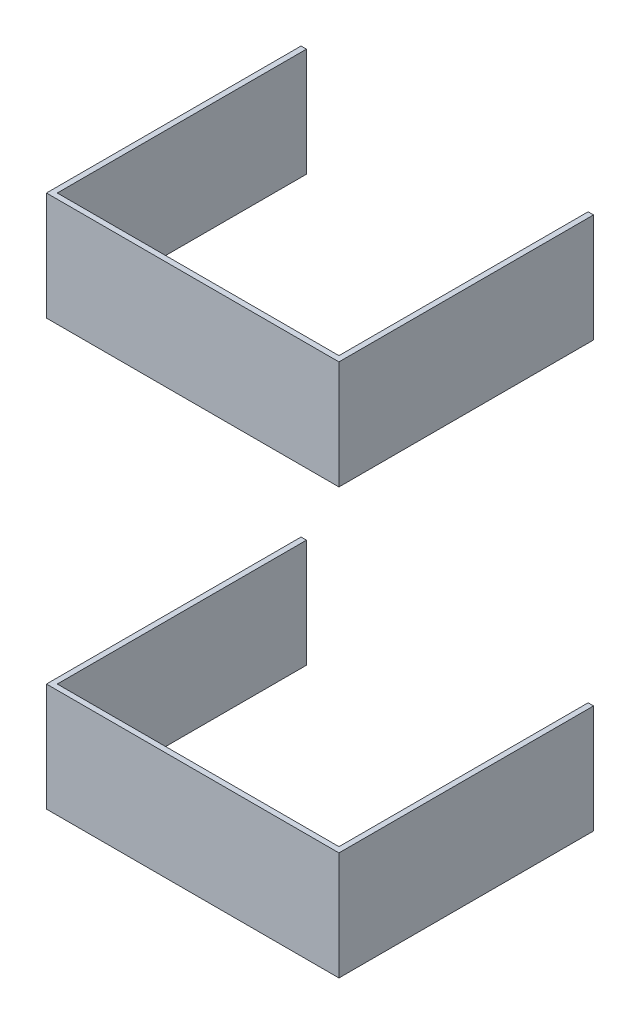
ISO-10303-21;
HEADER;
FILE_DESCRIPTION(('STEP AP214'),'2;1');
FILE_NAME('part.step','',(''),(''),'','','');
FILE_SCHEMA(('AUTOMOTIVE_DESIGN { 1 0 10303 214 1 1 1 1 }'));
ENDSEC;
DATA;
#1=APPLICATION_CONTEXT('core data for automotive mechanical design processes');
#2=APPLICATION_PROTOCOL_DEFINITION('international standard','automotive_design',2000,#1);
#3=PRODUCT_CONTEXT('',#1,'mechanical');
#4=PRODUCT('Part','Part','',(#3));
#5=PRODUCT_RELATED_PRODUCT_CATEGORY('part','',(#4));
#6=PRODUCT_DEFINITION_FORMATION('','',#4);
#7=PRODUCT_DEFINITION_CONTEXT('part definition',#1,'design');
#8=PRODUCT_DEFINITION('design','',#6,#7);
#9=PRODUCT_DEFINITION_SHAPE('','',#8);
#10=(LENGTH_UNIT() NAMED_UNIT(*) SI_UNIT(.MILLI.,.METRE.));
#11=(NAMED_UNIT(*) PLANE_ANGLE_UNIT() SI_UNIT($,.RADIAN.));
#12=(NAMED_UNIT(*) SI_UNIT($,.STERADIAN.) SOLID_ANGLE_UNIT());
#13=UNCERTAINTY_MEASURE_WITH_UNIT(LENGTH_MEASURE(1.E-05),#10,'distance_accuracy_value','');
#14=(GEOMETRIC_REPRESENTATION_CONTEXT(3) GLOBAL_UNCERTAINTY_ASSIGNED_CONTEXT((#13)) GLOBAL_UNIT_ASSIGNED_CONTEXT((#10,
#11,#12)) REPRESENTATION_CONTEXT('',''));
#15=CARTESIAN_POINT('',(0.,0.,0.));
#16=DIRECTION('',(0.,0.,1.));
#17=DIRECTION('',(1.,0.,0.));
#18=AXIS2_PLACEMENT_3D('',#15,#16,#17);
#19=CARTESIAN_POINT('',(1.,-28.25,183.5));
#20=DIRECTION('',(0.,1.,0.));
#21=DIRECTION('',(1.,0.,0.));
#22=AXIS2_PLACEMENT_3D('',#19,#20,#21);
#23=PLANE('',#22);
#24=DIRECTION('',(-1.,0.,0.));
#25=VECTOR('',#24,1.);
#26=CARTESIAN_POINT('',(1.,-28.25,230.5));
#27=LINE('',#26,#25);
#28=CARTESIAN_POINT('',(1.,-28.25,230.5));
#29=VERTEX_POINT('',#28);
#30=CARTESIAN_POINT('',(-53.,-28.25,230.5));
#31=VERTEX_POINT('',#30);
#32=EDGE_CURVE('P0_E177',#29,#31,#27,.T.);
#33=ORIENTED_EDGE('',*,*,#32,.F.);
#34=DIRECTION('',(0.,0.,1.));
#35=VECTOR('',#34,1.);
#36=CARTESIAN_POINT('',(1.,-28.25,183.5));
#37=LINE('',#36,#35);
#38=CARTESIAN_POINT('',(1.,-28.25,183.5));
#39=VERTEX_POINT('',#38);
#40=EDGE_CURVE('P0_E10',#39,#29,#37,.T.);
#41=ORIENTED_EDGE('',*,*,#40,.F.);
#42=DIRECTION('',(-1.,0.,0.));
#43=VECTOR('',#42,1.);
#44=CARTESIAN_POINT('',(1.,-28.25,183.5));
#45=LINE('',#44,#43);
#46=CARTESIAN_POINT('',(0.,-28.25,183.5));
#47=VERTEX_POINT('',#46);
#48=EDGE_CURVE('P0_E162',#39,#47,#45,.T.);
#49=ORIENTED_EDGE('',*,*,#48,.T.);
#50=DIRECTION('',(0.,0.,1.));
#51=VECTOR('',#50,1.);
#52=CARTESIAN_POINT('',(0.,-28.25,182.5));
#53=LINE('',#52,#51);
#54=CARTESIAN_POINT('',(0.,-28.25,229.5));
#55=VERTEX_POINT('',#54);
#56=EDGE_CURVE('P0_E146',#47,#55,#53,.T.);
#57=ORIENTED_EDGE('',*,*,#56,.T.);
#58=DIRECTION('',(1.,0.,0.));
#59=VECTOR('',#58,1.);
#60=CARTESIAN_POINT('',(0.5,-28.25,229.5));
#61=LINE('',#60,#59);
#62=CARTESIAN_POINT('',(-52.,-28.25,229.5));
#63=VERTEX_POINT('',#62);
#64=EDGE_CURVE('P0_E147',#63,#55,#61,.T.);
#65=ORIENTED_EDGE('',*,*,#64,.F.);
#66=DIRECTION('',(0.,0.,1.));
#67=VECTOR('',#66,1.);
#68=CARTESIAN_POINT('',(-52.,-28.25,182.5));
#69=LINE('',#68,#67);
#70=CARTESIAN_POINT('',(-52.,-28.25,183.5));
#71=VERTEX_POINT('',#70);
#72=EDGE_CURVE('P0_E110',#71,#63,#69,.T.);
#73=ORIENTED_EDGE('',*,*,#72,.F.);
#74=DIRECTION('',(-1.,0.,0.));
#75=VECTOR('',#74,1.);
#76=CARTESIAN_POINT('',(1.,-28.25,183.5));
#77=LINE('',#76,#75);
#78=CARTESIAN_POINT('',(-53.,-28.25,183.5));
#79=VERTEX_POINT('',#78);
#80=EDGE_CURVE('P0_E108',#71,#79,#77,.T.);
#81=ORIENTED_EDGE('',*,*,#80,.T.);
#82=DIRECTION('',(0.,0.,1.));
#83=VECTOR('',#82,1.);
#84=CARTESIAN_POINT('',(-53.,-28.25,183.5));
#85=LINE('',#84,#83);
#86=EDGE_CURVE('P0_E158',#79,#31,#85,.T.);
#87=ORIENTED_EDGE('',*,*,#86,.T.);
#88=EDGE_LOOP('',(#33,#41,#49,#57,#65,#73,#81,#87));
#89=FACE_BOUND('',#88,.T.);
#90=ADVANCED_FACE('P0_F15',(#89),#23,.T.);
#91=CARTESIAN_POINT('',(1.,-48.25,183.5));
#92=DIRECTION('',(-1.,0.,0.));
#93=DIRECTION('',(0.,0.,1.));
#94=AXIS2_PLACEMENT_3D('',#91,#92,#93);
#95=PLANE('',#94);
#96=ORIENTED_EDGE('',*,*,#40,.T.);
#97=DIRECTION('',(0.,1.,0.));
#98=VECTOR('',#97,1.);
#99=CARTESIAN_POINT('',(1.,-48.25,230.5));
#100=LINE('',#99,#98);
#101=CARTESIAN_POINT('',(1.,-48.25,230.5));
#102=VERTEX_POINT('',#101);
#103=EDGE_CURVE('P0_E173',#102,#29,#100,.T.);
#104=ORIENTED_EDGE('',*,*,#103,.F.);
#105=DIRECTION('',(0.,0.,1.));
#106=VECTOR('',#105,1.);
#107=CARTESIAN_POINT('',(1.,-48.25,183.5));
#108=LINE('',#107,#106);
#109=CARTESIAN_POINT('',(1.,-48.25,183.5));
#110=VERTEX_POINT('',#109);
#111=EDGE_CURVE('P0_E134',#110,#102,#108,.T.);
#112=ORIENTED_EDGE('',*,*,#111,.F.);
#113=DIRECTION('',(0.,1.,0.));
#114=VECTOR('',#113,1.);
#115=CARTESIAN_POINT('',(1.,-48.25,183.5));
#116=LINE('',#115,#114);
#117=EDGE_CURVE('P0_E26',#110,#39,#116,.T.);
#118=ORIENTED_EDGE('',*,*,#117,.T.);
#119=EDGE_LOOP('',(#96,#104,#112,#118));
#120=FACE_BOUND('',#119,.T.);
#121=ADVANCED_FACE('P0_F205',(#120),#95,.F.);
#122=CARTESIAN_POINT('',(1.,-48.25,183.5));
#123=DIRECTION('',(0.,0.,1.));
#124=DIRECTION('',(1.,0.,0.));
#125=AXIS2_PLACEMENT_3D('',#122,#123,#124);
#126=PLANE('',#125);
#127=DIRECTION('',(0.,-1.,0.));
#128=VECTOR('',#127,1.);
#129=CARTESIAN_POINT('',(0.,-48.75,183.5));
#130=LINE('',#129,#128);
#131=CARTESIAN_POINT('',(0.,-48.25,183.5));
#132=VERTEX_POINT('',#131);
#133=EDGE_CURVE('P0_E150',#47,#132,#130,.T.);
#134=ORIENTED_EDGE('',*,*,#133,.F.);
#135=ORIENTED_EDGE('',*,*,#48,.F.);
#136=ORIENTED_EDGE('',*,*,#117,.F.);
#137=DIRECTION('',(-1.,0.,0.));
#138=VECTOR('',#137,1.);
#139=CARTESIAN_POINT('',(1.,-48.25,183.5));
#140=LINE('',#139,#138);
#141=EDGE_CURVE('P0_E138',#110,#132,#140,.T.);
#142=ORIENTED_EDGE('',*,*,#141,.T.);
#143=EDGE_LOOP('',(#134,#135,#136,#142));
#144=FACE_BOUND('',#143,.T.);
#145=ADVANCED_FACE('P0_F202',(#144),#126,.F.);
#146=CARTESIAN_POINT('',(0.,-49.25,181.5));
#147=DIRECTION('',(-1.,0.,0.));
#148=DIRECTION('',(0.,0.,1.));
#149=AXIS2_PLACEMENT_3D('',#146,#147,#148);
#150=PLANE('',#149);
#151=DIRECTION('',(0.,1.,0.));
#152=VECTOR('',#151,1.);
#153=CARTESIAN_POINT('',(0.,-49.25,229.5));
#154=LINE('',#153,#152);
#155=CARTESIAN_POINT('',(0.,-48.25,229.5));
#156=VERTEX_POINT('',#155);
#157=EDGE_CURVE('P0_E142',#156,#55,#154,.T.);
#158=ORIENTED_EDGE('',*,*,#157,.T.);
#159=ORIENTED_EDGE('',*,*,#56,.F.);
#160=ORIENTED_EDGE('',*,*,#133,.T.);
#161=DIRECTION('',(0.,0.,1.));
#162=VECTOR('',#161,1.);
#163=CARTESIAN_POINT('',(0.,-48.25,182.5));
#164=LINE('',#163,#162);
#165=EDGE_CURVE('P0_E133',#132,#156,#164,.T.);
#166=ORIENTED_EDGE('',*,*,#165,.T.);
#167=EDGE_LOOP('',(#158,#159,#160,#166));
#168=FACE_BOUND('',#167,.T.);
#169=ADVANCED_FACE('P0_F194',(#168),#150,.T.);
#170=CARTESIAN_POINT('',(0.,-49.25,229.5));
#171=DIRECTION('',(0.,0.,1.));
#172=DIRECTION('',(1.,0.,0.));
#173=AXIS2_PLACEMENT_3D('',#170,#171,#172);
#174=PLANE('',#173);
#175=ORIENTED_EDGE('',*,*,#64,.T.);
#176=ORIENTED_EDGE('',*,*,#157,.F.);
#177=DIRECTION('',(1.,0.,0.));
#178=VECTOR('',#177,1.);
#179=CARTESIAN_POINT('',(0.5,-48.25,229.5));
#180=LINE('',#179,#178);
#181=CARTESIAN_POINT('',(-52.,-48.25,229.5));
#182=VERTEX_POINT('',#181);
#183=EDGE_CURVE('P0_E118',#182,#156,#180,.T.);
#184=ORIENTED_EDGE('',*,*,#183,.F.);
#185=DIRECTION('',(0.,1.,0.));
#186=VECTOR('',#185,1.);
#187=CARTESIAN_POINT('',(-52.,-49.25,229.5));
#188=LINE('',#187,#186);
#189=EDGE_CURVE('P0_E94',#182,#63,#188,.T.);
#190=ORIENTED_EDGE('',*,*,#189,.T.);
#191=EDGE_LOOP('',(#175,#176,#184,#190));
#192=FACE_BOUND('',#191,.T.);
#193=ADVANCED_FACE('P0_F199',(#192),#174,.F.);
#194=CARTESIAN_POINT('',(-52.,-49.25,181.5));
#195=DIRECTION('',(-1.,0.,0.));
#196=DIRECTION('',(0.,0.,1.));
#197=AXIS2_PLACEMENT_3D('',#194,#195,#196);
#198=PLANE('',#197);
#199=DIRECTION('',(0.,0.,1.));
#200=VECTOR('',#199,1.);
#201=CARTESIAN_POINT('',(-52.,-48.25,182.5));
#202=LINE('',#201,#200);
#203=CARTESIAN_POINT('',(-52.,-48.25,183.5));
#204=VERTEX_POINT('',#203);
#205=EDGE_CURVE('P0_E113',#204,#182,#202,.T.);
#206=ORIENTED_EDGE('',*,*,#205,.F.);
#207=DIRECTION('',(0.,-1.,0.));
#208=VECTOR('',#207,1.);
#209=CARTESIAN_POINT('',(-52.,-48.75,183.5));
#210=LINE('',#209,#208);
#211=EDGE_CURVE('P0_E103',#71,#204,#210,.T.);
#212=ORIENTED_EDGE('',*,*,#211,.F.);
#213=ORIENTED_EDGE('',*,*,#72,.T.);
#214=ORIENTED_EDGE('',*,*,#189,.F.);
#215=EDGE_LOOP('',(#206,#212,#213,#214));
#216=FACE_BOUND('',#215,.T.);
#217=ADVANCED_FACE('P0_F114',(#216),#198,.F.);
#218=CARTESIAN_POINT('',(1.,-48.25,183.5));
#219=DIRECTION('',(0.,0.,1.));
#220=DIRECTION('',(1.,0.,0.));
#221=AXIS2_PLACEMENT_3D('',#218,#219,#220);
#222=PLANE('',#221);
#223=DIRECTION('',(0.,1.,0.));
#224=VECTOR('',#223,1.);
#225=CARTESIAN_POINT('',(-53.,-48.25,183.5));
#226=LINE('',#225,#224);
#227=CARTESIAN_POINT('',(-53.,-48.25,183.5));
#228=VERTEX_POINT('',#227);
#229=EDGE_CURVE('P0_E166',#228,#79,#226,.T.);
#230=ORIENTED_EDGE('',*,*,#229,.T.);
#231=ORIENTED_EDGE('',*,*,#80,.F.);
#232=ORIENTED_EDGE('',*,*,#211,.T.);
#233=DIRECTION('',(-1.,0.,0.));
#234=VECTOR('',#233,1.);
#235=CARTESIAN_POINT('',(1.,-48.25,183.5));
#236=LINE('',#235,#234);
#237=EDGE_CURVE('P0_E106',#204,#228,#236,.T.);
#238=ORIENTED_EDGE('',*,*,#237,.T.);
#239=EDGE_LOOP('',(#230,#231,#232,#238));
#240=FACE_BOUND('',#239,.T.);
#241=ADVANCED_FACE('P0_F17',(#240),#222,.F.);
#242=CARTESIAN_POINT('',(-53.,-48.25,183.5));
#243=DIRECTION('',(-1.,0.,0.));
#244=DIRECTION('',(0.,0.,1.));
#245=AXIS2_PLACEMENT_3D('',#242,#243,#244);
#246=PLANE('',#245);
#247=ORIENTED_EDGE('',*,*,#229,.F.);
#248=DIRECTION('',(0.,0.,1.));
#249=VECTOR('',#248,1.);
#250=CARTESIAN_POINT('',(-53.,-48.25,183.5));
#251=LINE('',#250,#249);
#252=CARTESIAN_POINT('',(-53.,-48.25,230.5));
#253=VERTEX_POINT('',#252);
#254=EDGE_CURVE('P0_E123',#228,#253,#251,.T.);
#255=ORIENTED_EDGE('',*,*,#254,.T.);
#256=DIRECTION('',(0.,1.,0.));
#257=VECTOR('',#256,1.);
#258=CARTESIAN_POINT('',(-53.,-48.25,230.5));
#259=LINE('',#258,#257);
#260=EDGE_CURVE('P0_E19',#253,#31,#259,.T.);
#261=ORIENTED_EDGE('',*,*,#260,.T.);
#262=ORIENTED_EDGE('',*,*,#86,.F.);
#263=EDGE_LOOP('',(#247,#255,#261,#262));
#264=FACE_BOUND('',#263,.T.);
#265=ADVANCED_FACE('P0_F209',(#264),#246,.T.);
#266=CARTESIAN_POINT('',(1.,-48.25,230.5));
#267=DIRECTION('',(0.,0.,1.));
#268=DIRECTION('',(1.,0.,0.));
#269=AXIS2_PLACEMENT_3D('',#266,#267,#268);
#270=PLANE('',#269);
#271=DIRECTION('',(-1.,0.,0.));
#272=VECTOR('',#271,1.);
#273=CARTESIAN_POINT('',(1.,-48.25,230.5));
#274=LINE('',#273,#272);
#275=EDGE_CURVE('P0_E137',#102,#253,#274,.T.);
#276=ORIENTED_EDGE('',*,*,#275,.F.);
#277=ORIENTED_EDGE('',*,*,#103,.T.);
#278=ORIENTED_EDGE('',*,*,#32,.T.);
#279=ORIENTED_EDGE('',*,*,#260,.F.);
#280=EDGE_LOOP('',(#276,#277,#278,#279));
#281=FACE_BOUND('',#280,.T.);
#282=ADVANCED_FACE('P0_F206',(#281),#270,.T.);
#283=CARTESIAN_POINT('',(1.,-48.25,183.5));
#284=DIRECTION('',(0.,1.,0.));
#285=DIRECTION('',(1.,0.,0.));
#286=AXIS2_PLACEMENT_3D('',#283,#284,#285);
#287=PLANE('',#286);
#288=ORIENTED_EDGE('',*,*,#254,.F.);
#289=ORIENTED_EDGE('',*,*,#237,.F.);
#290=ORIENTED_EDGE('',*,*,#205,.T.);
#291=ORIENTED_EDGE('',*,*,#183,.T.);
#292=ORIENTED_EDGE('',*,*,#165,.F.);
#293=ORIENTED_EDGE('',*,*,#141,.F.);
#294=ORIENTED_EDGE('',*,*,#111,.T.);
#295=ORIENTED_EDGE('',*,*,#275,.T.);
#296=EDGE_LOOP('',(#288,#289,#290,#291,#292,#293,#294,#295));
#297=FACE_BOUND('',#296,.T.);
#298=ADVANCED_FACE('P0_F120',(#297),#287,.F.);
#299=CLOSED_SHELL('',(#90,#121,#145,#169,#193,#217,#241,#265,#282,#298));
#300=MANIFOLD_SOLID_BREP('P0_B1',#299);
#301=CARTESIAN_POINT('',(1.,50.25,183.5));
#302=DIRECTION('',(0.,1.,0.));
#303=DIRECTION('',(1.,0.,0.));
#304=AXIS2_PLACEMENT_3D('',#301,#302,#303);
#305=PLANE('',#304);
#306=DIRECTION('',(-1.,0.,0.));
#307=VECTOR('',#306,1.);
#308=CARTESIAN_POINT('',(1.,50.25,230.5));
#309=LINE('',#308,#307);
#310=CARTESIAN_POINT('',(1.,50.25,230.5));
#311=VERTEX_POINT('',#310);
#312=CARTESIAN_POINT('',(-53.,50.25,230.5));
#313=VERTEX_POINT('',#312);
#314=EDGE_CURVE('P1_E125',#311,#313,#309,.T.);
#315=ORIENTED_EDGE('',*,*,#314,.F.);
#316=DIRECTION('',(0.,0.,1.));
#317=VECTOR('',#316,1.);
#318=CARTESIAN_POINT('',(1.,50.25,183.5));
#319=LINE('',#318,#317);
#320=CARTESIAN_POINT('',(1.,50.25,183.5));
#321=VERTEX_POINT('',#320);
#322=EDGE_CURVE('P1_E10',#321,#311,#319,.T.);
#323=ORIENTED_EDGE('',*,*,#322,.F.);
#324=DIRECTION('',(-1.,0.,0.));
#325=VECTOR('',#324,1.);
#326=CARTESIAN_POINT('',(1.,50.25,183.5));
#327=LINE('',#326,#325);
#328=CARTESIAN_POINT('',(0.,50.25,183.5));
#329=VERTEX_POINT('',#328);
#330=EDGE_CURVE('P1_E135',#321,#329,#327,.T.);
#331=ORIENTED_EDGE('',*,*,#330,.T.);
#332=DIRECTION('',(0.,0.,1.));
#333=VECTOR('',#332,1.);
#334=CARTESIAN_POINT('',(0.,50.25,182.5));
#335=LINE('',#334,#333);
#336=CARTESIAN_POINT('',(0.,50.25,229.5));
#337=VERTEX_POINT('',#336);
#338=EDGE_CURVE('P1_E130',#329,#337,#335,.T.);
#339=ORIENTED_EDGE('',*,*,#338,.T.);
#340=DIRECTION('',(1.,0.,0.));
#341=VECTOR('',#340,1.);
#342=CARTESIAN_POINT('',(0.5,50.25,229.5));
#343=LINE('',#342,#341);
#344=CARTESIAN_POINT('',(-52.,50.25,229.5));
#345=VERTEX_POINT('',#344);
#346=EDGE_CURVE('P1_E19',#345,#337,#343,.T.);
#347=ORIENTED_EDGE('',*,*,#346,.F.);
#348=DIRECTION('',(0.,0.,1.));
#349=VECTOR('',#348,1.);
#350=CARTESIAN_POINT('',(-52.,50.25,182.5));
#351=LINE('',#350,#349);
#352=CARTESIAN_POINT('',(-52.,50.25,183.5));
#353=VERTEX_POINT('',#352);
#354=EDGE_CURVE('P1_E163',#353,#345,#351,.T.);
#355=ORIENTED_EDGE('',*,*,#354,.F.);
#356=DIRECTION('',(-1.,0.,0.));
#357=VECTOR('',#356,1.);
#358=CARTESIAN_POINT('',(1.,50.25,183.5));
#359=LINE('',#358,#357);
#360=CARTESIAN_POINT('',(-53.,50.25,183.5));
#361=VERTEX_POINT('',#360);
#362=EDGE_CURVE('P1_E142',#353,#361,#359,.T.);
#363=ORIENTED_EDGE('',*,*,#362,.T.);
#364=DIRECTION('',(0.,0.,1.));
#365=VECTOR('',#364,1.);
#366=CARTESIAN_POINT('',(-53.,50.25,183.5));
#367=LINE('',#366,#365);
#368=EDGE_CURVE('P1_E95',#361,#313,#367,.T.);
#369=ORIENTED_EDGE('',*,*,#368,.T.);
#370=EDGE_LOOP('',(#315,#323,#331,#339,#347,#355,#363,#369));
#371=FACE_BOUND('',#370,.T.);
#372=ADVANCED_FACE('P1_F15',(#371),#305,.T.);
#373=CARTESIAN_POINT('',(1.,30.25,183.5));
#374=DIRECTION('',(-1.,0.,0.));
#375=DIRECTION('',(0.,0.,1.));
#376=AXIS2_PLACEMENT_3D('',#373,#374,#375);
#377=PLANE('',#376);
#378=ORIENTED_EDGE('',*,*,#322,.T.);
#379=DIRECTION('',(0.,1.,0.));
#380=VECTOR('',#379,1.);
#381=CARTESIAN_POINT('',(1.,30.25,230.5));
#382=LINE('',#381,#380);
#383=CARTESIAN_POINT('',(1.,30.25,230.5));
#384=VERTEX_POINT('',#383);
#385=EDGE_CURVE('P1_E138',#384,#311,#382,.T.);
#386=ORIENTED_EDGE('',*,*,#385,.F.);
#387=DIRECTION('',(0.,0.,1.));
#388=VECTOR('',#387,1.);
#389=CARTESIAN_POINT('',(1.,30.25,183.5));
#390=LINE('',#389,#388);
#391=CARTESIAN_POINT('',(1.,30.25,183.5));
#392=VERTEX_POINT('',#391);
#393=EDGE_CURVE('P1_E127',#392,#384,#390,.T.);
#394=ORIENTED_EDGE('',*,*,#393,.F.);
#395=DIRECTION('',(0.,1.,0.));
#396=VECTOR('',#395,1.);
#397=CARTESIAN_POINT('',(1.,30.25,183.5));
#398=LINE('',#397,#396);
#399=EDGE_CURVE('P1_E26',#392,#321,#398,.T.);
#400=ORIENTED_EDGE('',*,*,#399,.T.);
#401=EDGE_LOOP('',(#378,#386,#394,#400));
#402=FACE_BOUND('',#401,.T.);
#403=ADVANCED_FACE('P1_F197',(#402),#377,.F.);
#404=CARTESIAN_POINT('',(1.,30.25,183.5));
#405=DIRECTION('',(0.,0.,1.));
#406=DIRECTION('',(1.,0.,0.));
#407=AXIS2_PLACEMENT_3D('',#404,#405,#406);
#408=PLANE('',#407);
#409=DIRECTION('',(0.,-1.,0.));
#410=VECTOR('',#409,1.);
#411=CARTESIAN_POINT('',(0.,29.75,183.5));
#412=LINE('',#411,#410);
#413=CARTESIAN_POINT('',(0.,30.25,183.5));
#414=VERTEX_POINT('',#413);
#415=EDGE_CURVE('P1_E133',#329,#414,#412,.T.);
#416=ORIENTED_EDGE('',*,*,#415,.F.);
#417=ORIENTED_EDGE('',*,*,#330,.F.);
#418=ORIENTED_EDGE('',*,*,#399,.F.);
#419=DIRECTION('',(-1.,0.,0.));
#420=VECTOR('',#419,1.);
#421=CARTESIAN_POINT('',(1.,30.25,183.5));
#422=LINE('',#421,#420);
#423=EDGE_CURVE('P1_E129',#392,#414,#422,.T.);
#424=ORIENTED_EDGE('',*,*,#423,.T.);
#425=EDGE_LOOP('',(#416,#417,#418,#424));
#426=FACE_BOUND('',#425,.T.);
#427=ADVANCED_FACE('P1_F212',(#426),#408,.F.);
#428=CARTESIAN_POINT('',(0.,29.25,181.5));
#429=DIRECTION('',(-1.,0.,0.));
#430=DIRECTION('',(0.,0.,1.));
#431=AXIS2_PLACEMENT_3D('',#428,#429,#430);
#432=PLANE('',#431);
#433=DIRECTION('',(0.,1.,0.));
#434=VECTOR('',#433,1.);
#435=CARTESIAN_POINT('',(0.,29.25,229.5));
#436=LINE('',#435,#434);
#437=CARTESIAN_POINT('',(0.,30.25,229.5));
#438=VERTEX_POINT('',#437);
#439=EDGE_CURVE('P1_E134',#438,#337,#436,.T.);
#440=ORIENTED_EDGE('',*,*,#439,.T.);
#441=ORIENTED_EDGE('',*,*,#338,.F.);
#442=ORIENTED_EDGE('',*,*,#415,.T.);
#443=DIRECTION('',(0.,0.,1.));
#444=VECTOR('',#443,1.);
#445=CARTESIAN_POINT('',(0.,30.25,182.5));
#446=LINE('',#445,#444);
#447=EDGE_CURVE('P1_E151',#414,#438,#446,.T.);
#448=ORIENTED_EDGE('',*,*,#447,.T.);
#449=EDGE_LOOP('',(#440,#441,#442,#448));
#450=FACE_BOUND('',#449,.T.);
#451=ADVANCED_FACE('P1_F17',(#450),#432,.T.);
#452=CARTESIAN_POINT('',(0.,29.25,229.5));
#453=DIRECTION('',(0.,0.,1.));
#454=DIRECTION('',(1.,0.,0.));
#455=AXIS2_PLACEMENT_3D('',#452,#453,#454);
#456=PLANE('',#455);
#457=ORIENTED_EDGE('',*,*,#346,.T.);
#458=ORIENTED_EDGE('',*,*,#439,.F.);
#459=DIRECTION('',(1.,0.,0.));
#460=VECTOR('',#459,1.);
#461=CARTESIAN_POINT('',(0.5,30.25,229.5));
#462=LINE('',#461,#460);
#463=CARTESIAN_POINT('',(-52.,30.25,229.5));
#464=VERTEX_POINT('',#463);
#465=EDGE_CURVE('P1_E147',#464,#438,#462,.T.);
#466=ORIENTED_EDGE('',*,*,#465,.F.);
#467=DIRECTION('',(0.,1.,0.));
#468=VECTOR('',#467,1.);
#469=CARTESIAN_POINT('',(-52.,29.25,229.5));
#470=LINE('',#469,#468);
#471=EDGE_CURVE('P1_E160',#464,#345,#470,.T.);
#472=ORIENTED_EDGE('',*,*,#471,.T.);
#473=EDGE_LOOP('',(#457,#458,#466,#472));
#474=FACE_BOUND('',#473,.T.);
#475=ADVANCED_FACE('P1_F211',(#474),#456,.F.);
#476=CARTESIAN_POINT('',(-52.,29.25,181.5));
#477=DIRECTION('',(-1.,0.,0.));
#478=DIRECTION('',(0.,0.,1.));
#479=AXIS2_PLACEMENT_3D('',#476,#477,#478);
#480=PLANE('',#479);
#481=DIRECTION('',(0.,0.,1.));
#482=VECTOR('',#481,1.);
#483=CARTESIAN_POINT('',(-52.,30.25,182.5));
#484=LINE('',#483,#482);
#485=CARTESIAN_POINT('',(-52.,30.25,183.5));
#486=VERTEX_POINT('',#485);
#487=EDGE_CURVE('P1_E111',#486,#464,#484,.T.);
#488=ORIENTED_EDGE('',*,*,#487,.F.);
#489=DIRECTION('',(0.,-1.,0.));
#490=VECTOR('',#489,1.);
#491=CARTESIAN_POINT('',(-52.,29.75,183.5));
#492=LINE('',#491,#490);
#493=EDGE_CURVE('P1_E106',#353,#486,#492,.T.);
#494=ORIENTED_EDGE('',*,*,#493,.F.);
#495=ORIENTED_EDGE('',*,*,#354,.T.);
#496=ORIENTED_EDGE('',*,*,#471,.F.);
#497=EDGE_LOOP('',(#488,#494,#495,#496));
#498=FACE_BOUND('',#497,.T.);
#499=ADVANCED_FACE('P1_F235',(#498),#480,.F.);
#500=CARTESIAN_POINT('',(1.,30.25,183.5));
#501=DIRECTION('',(0.,0.,1.));
#502=DIRECTION('',(1.,0.,0.));
#503=AXIS2_PLACEMENT_3D('',#500,#501,#502);
#504=PLANE('',#503);
#505=DIRECTION('',(0.,1.,0.));
#506=VECTOR('',#505,1.);
#507=CARTESIAN_POINT('',(-53.,30.25,183.5));
#508=LINE('',#507,#506);
#509=CARTESIAN_POINT('',(-53.,30.25,183.5));
#510=VERTEX_POINT('',#509);
#511=EDGE_CURVE('P1_E88',#510,#361,#508,.T.);
#512=ORIENTED_EDGE('',*,*,#511,.T.);
#513=ORIENTED_EDGE('',*,*,#362,.F.);
#514=ORIENTED_EDGE('',*,*,#493,.T.);
#515=DIRECTION('',(-1.,0.,0.));
#516=VECTOR('',#515,1.);
#517=CARTESIAN_POINT('',(1.,30.25,183.5));
#518=LINE('',#517,#516);
#519=EDGE_CURVE('P1_E103',#486,#510,#518,.T.);
#520=ORIENTED_EDGE('',*,*,#519,.T.);
#521=EDGE_LOOP('',(#512,#513,#514,#520));
#522=FACE_BOUND('',#521,.T.);
#523=ADVANCED_FACE('P1_F104',(#522),#504,.F.);
#524=CARTESIAN_POINT('',(-53.,30.25,183.5));
#525=DIRECTION('',(-1.,0.,0.));
#526=DIRECTION('',(0.,0.,1.));
#527=AXIS2_PLACEMENT_3D('',#524,#525,#526);
#528=PLANE('',#527);
#529=ORIENTED_EDGE('',*,*,#511,.F.);
#530=DIRECTION('',(0.,0.,1.));
#531=VECTOR('',#530,1.);
#532=CARTESIAN_POINT('',(-53.,30.25,183.5));
#533=LINE('',#532,#531);
#534=CARTESIAN_POINT('',(-53.,30.25,230.5));
#535=VERTEX_POINT('',#534);
#536=EDGE_CURVE('P1_E93',#510,#535,#533,.T.);
#537=ORIENTED_EDGE('',*,*,#536,.T.);
#538=DIRECTION('',(0.,1.,0.));
#539=VECTOR('',#538,1.);
#540=CARTESIAN_POINT('',(-53.,30.25,230.5));
#541=LINE('',#540,#539);
#542=EDGE_CURVE('P1_E99',#535,#313,#541,.T.);
#543=ORIENTED_EDGE('',*,*,#542,.T.);
#544=ORIENTED_EDGE('',*,*,#368,.F.);
#545=EDGE_LOOP('',(#529,#537,#543,#544));
#546=FACE_BOUND('',#545,.T.);
#547=ADVANCED_FACE('P1_F90',(#546),#528,.T.);
#548=CARTESIAN_POINT('',(1.,30.25,230.5));
#549=DIRECTION('',(0.,0.,1.));
#550=DIRECTION('',(1.,0.,0.));
#551=AXIS2_PLACEMENT_3D('',#548,#549,#550);
#552=PLANE('',#551);
#553=DIRECTION('',(-1.,0.,0.));
#554=VECTOR('',#553,1.);
#555=CARTESIAN_POINT('',(1.,30.25,230.5));
#556=LINE('',#555,#554);
#557=EDGE_CURVE('P1_E117',#384,#535,#556,.T.);
#558=ORIENTED_EDGE('',*,*,#557,.F.);
#559=ORIENTED_EDGE('',*,*,#385,.T.);
#560=ORIENTED_EDGE('',*,*,#314,.T.);
#561=ORIENTED_EDGE('',*,*,#542,.F.);
#562=EDGE_LOOP('',(#558,#559,#560,#561));
#563=FACE_BOUND('',#562,.T.);
#564=ADVANCED_FACE('P1_F192',(#563),#552,.T.);
#565=CARTESIAN_POINT('',(1.,30.25,183.5));
#566=DIRECTION('',(0.,1.,0.));
#567=DIRECTION('',(1.,0.,0.));
#568=AXIS2_PLACEMENT_3D('',#565,#566,#567);
#569=PLANE('',#568);
#570=ORIENTED_EDGE('',*,*,#536,.F.);
#571=ORIENTED_EDGE('',*,*,#519,.F.);
#572=ORIENTED_EDGE('',*,*,#487,.T.);
#573=ORIENTED_EDGE('',*,*,#465,.T.);
#574=ORIENTED_EDGE('',*,*,#447,.F.);
#575=ORIENTED_EDGE('',*,*,#423,.F.);
#576=ORIENTED_EDGE('',*,*,#393,.T.);
#577=ORIENTED_EDGE('',*,*,#557,.T.);
#578=EDGE_LOOP('',(#570,#571,#572,#573,#574,#575,#576,#577));
#579=FACE_BOUND('',#578,.T.);
#580=ADVANCED_FACE('P1_F114',(#579),#569,.F.);
#581=CLOSED_SHELL('',(#372,#403,#427,#451,#475,#499,#523,#547,#564,#580));
#582=MANIFOLD_SOLID_BREP('P1_B1',#581);
#583=ADVANCED_BREP_SHAPE_REPRESENTATION('',(#18,#300,#582),#14);
#584=SHAPE_DEFINITION_REPRESENTATION(#9,#583);
ENDSEC;
END-ISO-10303-21;
